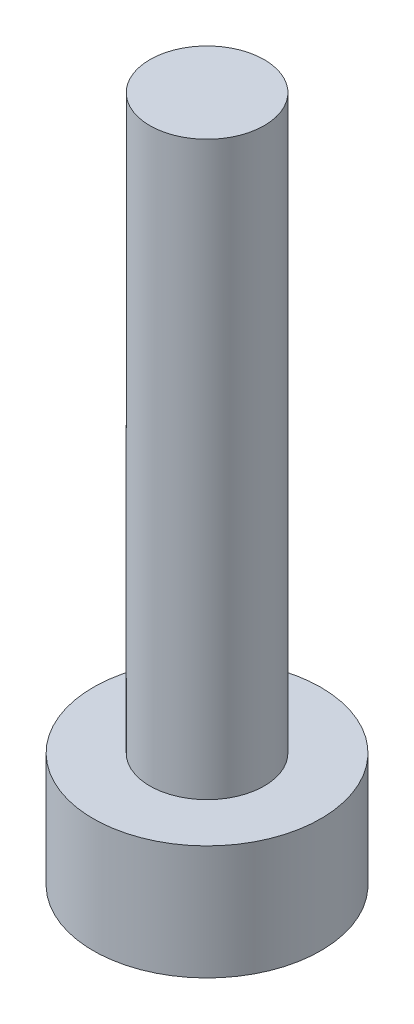
ISO-10303-21;
HEADER;
FILE_DESCRIPTION(('STEP AP214'),'2;1');
FILE_NAME('part.step','',(''),(''),'','','');
FILE_SCHEMA(('AUTOMOTIVE_DESIGN { 1 0 10303 214 1 1 1 1 }'));
ENDSEC;
DATA;
#1=APPLICATION_CONTEXT('core data for automotive mechanical design processes');
#2=APPLICATION_PROTOCOL_DEFINITION('international standard','automotive_design',2000,#1);
#3=PRODUCT_CONTEXT('',#1,'mechanical');
#4=PRODUCT('Part','Part','',(#3));
#5=PRODUCT_RELATED_PRODUCT_CATEGORY('part','',(#4));
#6=PRODUCT_DEFINITION_FORMATION('','',#4);
#7=PRODUCT_DEFINITION_CONTEXT('part definition',#1,'design');
#8=PRODUCT_DEFINITION('design','',#6,#7);
#9=PRODUCT_DEFINITION_SHAPE('','',#8);
#10=(LENGTH_UNIT() NAMED_UNIT(*) SI_UNIT(.MILLI.,.METRE.));
#11=(NAMED_UNIT(*) PLANE_ANGLE_UNIT() SI_UNIT($,.RADIAN.));
#12=(NAMED_UNIT(*) SI_UNIT($,.STERADIAN.) SOLID_ANGLE_UNIT());
#13=UNCERTAINTY_MEASURE_WITH_UNIT(LENGTH_MEASURE(1.E-05),#10,'distance_accuracy_value','');
#14=(GEOMETRIC_REPRESENTATION_CONTEXT(3) GLOBAL_UNCERTAINTY_ASSIGNED_CONTEXT((#13)) GLOBAL_UNIT_ASSIGNED_CONTEXT((#10,
#11,#12)) REPRESENTATION_CONTEXT('',''));
#15=CARTESIAN_POINT('',(0.,0.,0.));
#16=DIRECTION('',(0.,0.,1.));
#17=DIRECTION('',(1.,0.,0.));
#18=AXIS2_PLACEMENT_3D('',#15,#16,#17);
#19=CARTESIAN_POINT('',(0.,10.,0.));
#20=DIRECTION('',(0.,-1.,0.));
#21=DIRECTION('',(0.,0.,-1.));
#22=AXIS2_PLACEMENT_3D('',#19,#20,#21);
#23=CYLINDRICAL_SURFACE('',#22,1.);
#24=CARTESIAN_POINT('',(0.,10.,0.));
#25=DIRECTION('',(0.,1.,0.));
#26=DIRECTION('',(0.,0.,1.));
#27=AXIS2_PLACEMENT_3D('',#24,#25,#26);
#28=CIRCLE('',#27,1.);
#29=CARTESIAN_POINT('',(0.,10.,1.));
#30=VERTEX_POINT('',#29);
#31=EDGE_CURVE('E10',#30,#30,#28,.T.);
#32=ORIENTED_EDGE('',*,*,#31,.F.);
#33=EDGE_LOOP('',(#32));
#34=FACE_BOUND('',#33,.T.);
#35=CARTESIAN_POINT('',(0.,0.,0.));
#36=DIRECTION('',(0.,-1.,0.));
#37=DIRECTION('',(0.,0.,-1.));
#38=AXIS2_PLACEMENT_3D('',#35,#36,#37);
#39=CIRCLE('',#38,1.);
#40=CARTESIAN_POINT('',(0.,0.,-1.));
#41=VERTEX_POINT('',#40);
#42=EDGE_CURVE('E38',#41,#41,#39,.T.);
#43=ORIENTED_EDGE('',*,*,#42,.F.);
#44=EDGE_LOOP('',(#43));
#45=FACE_BOUND('',#44,.T.);
#46=ADVANCED_FACE('F32',(#34,#45),#23,.T.);
#47=CARTESIAN_POINT('',(0.,10.,0.));
#48=DIRECTION('',(0.,1.,0.));
#49=DIRECTION('',(0.,0.,1.));
#50=AXIS2_PLACEMENT_3D('',#47,#48,#49);
#51=PLANE('',#50);
#52=ORIENTED_EDGE('',*,*,#31,.T.);
#53=EDGE_LOOP('',(#52));
#54=FACE_BOUND('',#53,.T.);
#55=ADVANCED_FACE('F65',(#54),#51,.T.);
#56=CARTESIAN_POINT('',(0.,-2.,0.));
#57=DIRECTION('',(0.,1.,0.));
#58=DIRECTION('',(0.,0.,1.));
#59=AXIS2_PLACEMENT_3D('',#56,#57,#58);
#60=CYLINDRICAL_SURFACE('',#59,1.99);
#61=CARTESIAN_POINT('',(0.,-2.,0.));
#62=DIRECTION('',(0.,-1.,0.));
#63=DIRECTION('',(0.,0.,-1.));
#64=AXIS2_PLACEMENT_3D('',#61,#62,#63);
#65=CIRCLE('',#64,1.99);
#66=CARTESIAN_POINT('',(0.,-2.,-1.99));
#67=VERTEX_POINT('',#66);
#68=EDGE_CURVE('E42',#67,#67,#65,.T.);
#69=ORIENTED_EDGE('',*,*,#68,.F.);
#70=EDGE_LOOP('',(#69));
#71=FACE_BOUND('',#70,.T.);
#72=CARTESIAN_POINT('',(0.,0.,0.));
#73=DIRECTION('',(0.,-1.,0.));
#74=DIRECTION('',(0.,0.,-1.));
#75=AXIS2_PLACEMENT_3D('',#72,#73,#74);
#76=CIRCLE('',#75,1.99);
#77=CARTESIAN_POINT('',(0.,0.,-1.99));
#78=VERTEX_POINT('',#77);
#79=EDGE_CURVE('E46',#78,#78,#76,.T.);
#80=ORIENTED_EDGE('',*,*,#79,.T.);
#81=EDGE_LOOP('',(#80));
#82=FACE_BOUND('',#81,.T.);
#83=ADVANCED_FACE('F52',(#71,#82),#60,.T.);
#84=CARTESIAN_POINT('',(0.,-2.,0.));
#85=DIRECTION('',(0.,-1.,0.));
#86=DIRECTION('',(0.,0.,-1.));
#87=AXIS2_PLACEMENT_3D('',#84,#85,#86);
#88=PLANE('',#87);
#89=ORIENTED_EDGE('',*,*,#68,.T.);
#90=EDGE_LOOP('',(#89));
#91=FACE_BOUND('',#90,.T.);
#92=ADVANCED_FACE('F56',(#91),#88,.T.);
#93=CARTESIAN_POINT('',(0.,0.,0.));
#94=DIRECTION('',(0.,-1.,0.));
#95=DIRECTION('',(0.,0.,-1.));
#96=AXIS2_PLACEMENT_3D('',#93,#94,#95);
#97=PLANE('',#96);
#98=ORIENTED_EDGE('',*,*,#42,.T.);
#99=EDGE_LOOP('',(#98));
#100=FACE_BOUND('',#99,.T.);
#101=ORIENTED_EDGE('',*,*,#79,.F.);
#102=EDGE_LOOP('',(#101));
#103=FACE_BOUND('',#102,.T.);
#104=ADVANCED_FACE('F54',(#100,#103),#97,.F.);
#105=CLOSED_SHELL('',(#46,#55,#83,#92,#104));
#106=MANIFOLD_SOLID_BREP('B2',#105);
#107=ADVANCED_BREP_SHAPE_REPRESENTATION('',(#18,#106),#14);
#108=SHAPE_DEFINITION_REPRESENTATION(#9,#107);
ENDSEC;
END-ISO-10303-21;
